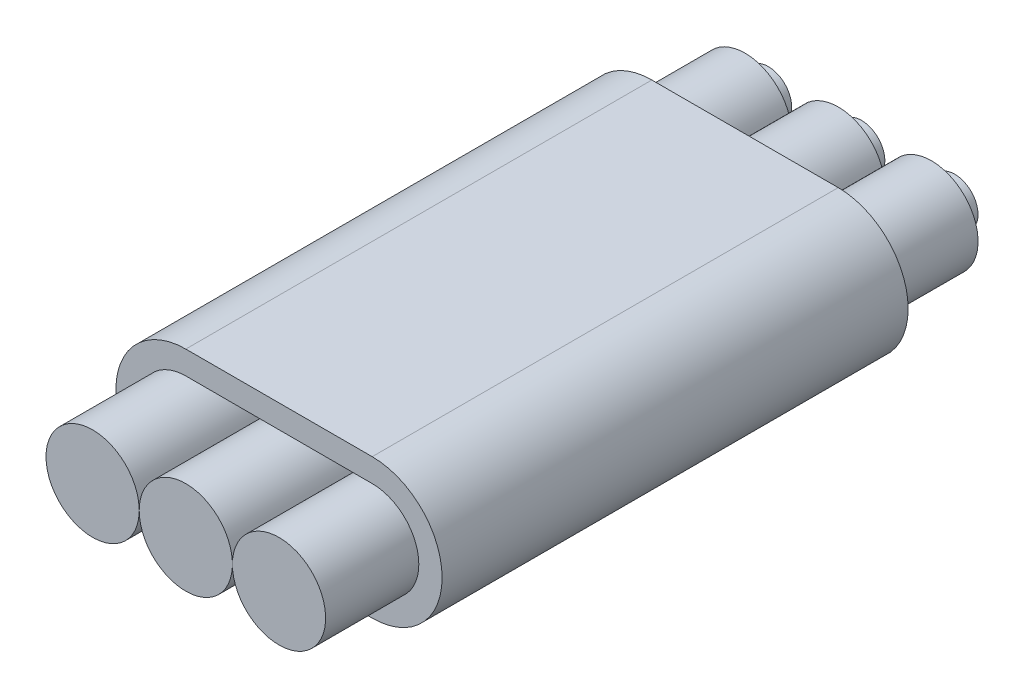
ISO-10303-21;
HEADER;
FILE_DESCRIPTION(('STEP AP214'),'2;1');
FILE_NAME('part.step','',(''),(''),'','','');
FILE_SCHEMA(('AUTOMOTIVE_DESIGN { 1 0 10303 214 1 1 1 1 }'));
ENDSEC;
DATA;
#1=APPLICATION_CONTEXT('core data for automotive mechanical design processes');
#2=APPLICATION_PROTOCOL_DEFINITION('international standard','automotive_design',2000,#1);
#3=PRODUCT_CONTEXT('',#1,'mechanical');
#4=PRODUCT('Part','Part','',(#3));
#5=PRODUCT_RELATED_PRODUCT_CATEGORY('part','',(#4));
#6=PRODUCT_DEFINITION_FORMATION('','',#4);
#7=PRODUCT_DEFINITION_CONTEXT('part definition',#1,'design');
#8=PRODUCT_DEFINITION('design','',#6,#7);
#9=PRODUCT_DEFINITION_SHAPE('','',#8);
#10=(LENGTH_UNIT() NAMED_UNIT(*) SI_UNIT(.MILLI.,.METRE.));
#11=(NAMED_UNIT(*) PLANE_ANGLE_UNIT() SI_UNIT($,.RADIAN.));
#12=(NAMED_UNIT(*) SI_UNIT($,.STERADIAN.) SOLID_ANGLE_UNIT());
#13=UNCERTAINTY_MEASURE_WITH_UNIT(LENGTH_MEASURE(1.E-05),#10,'distance_accuracy_value','');
#14=(GEOMETRIC_REPRESENTATION_CONTEXT(3) GLOBAL_UNCERTAINTY_ASSIGNED_CONTEXT((#13)) GLOBAL_UNIT_ASSIGNED_CONTEXT((#10,
#11,#12)) REPRESENTATION_CONTEXT('',''));
#15=CARTESIAN_POINT('',(0.,0.,0.));
#16=DIRECTION('',(0.,0.,1.));
#17=DIRECTION('',(1.,0.,0.));
#18=AXIS2_PLACEMENT_3D('',#15,#16,#17);
#19=CARTESIAN_POINT('',(0.,0.,12.));
#20=DIRECTION('',(0.,0.,-1.));
#21=DIRECTION('',(-1.,0.,0.));
#22=AXIS2_PLACEMENT_3D('',#19,#20,#21);
#23=CYLINDRICAL_SURFACE('',#22,1.);
#24=CARTESIAN_POINT('',(0.,0.,12.));
#25=DIRECTION('',(0.,0.,-1.));
#26=DIRECTION('',(-1.,0.,0.));
#27=AXIS2_PLACEMENT_3D('',#24,#25,#26);
#28=CIRCLE('',#27,1.);
#29=CARTESIAN_POINT('',(-1.,0.,12.));
#30=VERTEX_POINT('',#29);
#31=EDGE_CURVE('E132',#30,#30,#28,.T.);
#32=ORIENTED_EDGE('',*,*,#31,.T.);
#33=EDGE_LOOP('',(#32));
#34=FACE_BOUND('',#33,.T.);
#35=CARTESIAN_POINT('',(0.,0.,-2.));
#36=DIRECTION('',(0.,0.,-1.));
#37=DIRECTION('',(-1.,0.,0.));
#38=AXIS2_PLACEMENT_3D('',#35,#36,#37);
#39=CIRCLE('',#38,1.);
#40=CARTESIAN_POINT('',(-1.,0.,-2.));
#41=VERTEX_POINT('',#40);
#42=EDGE_CURVE('E128',#41,#41,#39,.T.);
#43=ORIENTED_EDGE('',*,*,#42,.F.);
#44=EDGE_LOOP('',(#43));
#45=FACE_BOUND('',#44,.T.);
#46=ADVANCED_FACE('F124',(#34,#45),#23,.T.);
#47=CARTESIAN_POINT('',(0.,0.,-2.));
#48=DIRECTION('',(0.,0.,-1.));
#49=DIRECTION('',(-1.,0.,0.));
#50=AXIS2_PLACEMENT_3D('',#47,#48,#49);
#51=PLANE('',#50);
#52=ORIENTED_EDGE('',*,*,#42,.T.);
#53=EDGE_LOOP('',(#52));
#54=FACE_BOUND('',#53,.T.);
#55=CARTESIAN_POINT('',(0.,0.,-2.));
#56=DIRECTION('',(0.,0.,-1.));
#57=DIRECTION('',(-1.,0.,0.));
#58=AXIS2_PLACEMENT_3D('',#55,#56,#57);
#59=CIRCLE('',#58,0.5);
#60=CARTESIAN_POINT('',(-0.5,0.,-2.));
#61=VERTEX_POINT('',#60);
#62=EDGE_CURVE('E12',#61,#61,#59,.T.);
#63=ORIENTED_EDGE('',*,*,#62,.F.);
#64=EDGE_LOOP('',(#63));
#65=FACE_BOUND('',#64,.T.);
#66=ADVANCED_FACE('F123',(#54,#65),#51,.T.);
#67=CARTESIAN_POINT('',(0.,0.,12.));
#68=DIRECTION('',(0.,0.,-1.));
#69=DIRECTION('',(-1.,0.,0.));
#70=AXIS2_PLACEMENT_3D('',#67,#68,#69);
#71=PLANE('',#70);
#72=ORIENTED_EDGE('',*,*,#31,.F.);
#73=EDGE_LOOP('',(#72));
#74=FACE_BOUND('',#73,.T.);
#75=ADVANCED_FACE('F149',(#74),#71,.F.);
#76=CARTESIAN_POINT('',(0.,0.,13.4142135623731));
#77=DIRECTION('',(0.,0.,-1.));
#78=DIRECTION('',(-1.,0.,0.));
#79=AXIS2_PLACEMENT_3D('',#76,#77,#78);
#80=CYLINDRICAL_SURFACE('',#79,0.5);
#81=ORIENTED_EDGE('',*,*,#62,.T.);
#82=EDGE_LOOP('',(#81));
#83=FACE_BOUND('',#82,.T.);
#84=CARTESIAN_POINT('',(0.,0.,-2.5));
#85=DIRECTION('',(0.,0.,-1.));
#86=DIRECTION('',(-1.,0.,0.));
#87=AXIS2_PLACEMENT_3D('',#84,#85,#86);
#88=CIRCLE('',#87,0.5);
#89=CARTESIAN_POINT('',(-0.5,0.,-2.5));
#90=VERTEX_POINT('',#89);
#91=EDGE_CURVE('E139',#90,#90,#88,.T.);
#92=ORIENTED_EDGE('',*,*,#91,.F.);
#93=EDGE_LOOP('',(#92));
#94=FACE_BOUND('',#93,.T.);
#95=ADVANCED_FACE('F147',(#83,#94),#80,.T.);
#96=CARTESIAN_POINT('',(0.,0.,-2.5));
#97=DIRECTION('',(0.,0.,-1.));
#98=DIRECTION('',(-1.,0.,0.));
#99=AXIS2_PLACEMENT_3D('',#96,#97,#98);
#100=PLANE('',#99);
#101=ORIENTED_EDGE('',*,*,#91,.T.);
#102=EDGE_LOOP('',(#101));
#103=FACE_BOUND('',#102,.T.);
#104=ADVANCED_FACE('F144',(#103),#100,.T.);
#105=CLOSED_SHELL('',(#46,#66,#75,#95,#104));
#106=MANIFOLD_SOLID_BREP('B2',#105);
#107=CARTESIAN_POINT('',(-2.,0.,10.));
#108=DIRECTION('',(0.,0.,1.));
#109=DIRECTION('',(1.,0.,0.));
#110=AXIS2_PLACEMENT_3D('',#107,#108,#109);
#111=PLANE('',#110);
#112=CARTESIAN_POINT('',(-2.,0.,10.));
#113=DIRECTION('',(0.,0.,1.));
#114=DIRECTION('',(1.,0.,0.));
#115=AXIS2_PLACEMENT_3D('',#112,#113,#114);
#116=CIRCLE('',#115,1.5);
#117=CARTESIAN_POINT('',(-2.,1.5,10.));
#118=VERTEX_POINT('',#117);
#119=CARTESIAN_POINT('',(-2.,-1.5,10.));
#120=VERTEX_POINT('',#119);
#121=EDGE_CURVE('E310',#118,#120,#116,.T.);
#122=ORIENTED_EDGE('',*,*,#121,.T.);
#123=DIRECTION('',(1.,0.,0.));
#124=VECTOR('',#123,1.);
#125=CARTESIAN_POINT('',(-2.,-1.5,10.));
#126=LINE('',#125,#124);
#127=CARTESIAN_POINT('',(2.,-1.5,10.));
#128=VERTEX_POINT('',#127);
#129=EDGE_CURVE('E309',#120,#128,#126,.T.);
#130=ORIENTED_EDGE('',*,*,#129,.T.);
#131=CARTESIAN_POINT('',(2.,0.,10.));
#132=DIRECTION('',(0.,0.,1.));
#133=DIRECTION('',(1.,0.,0.));
#134=AXIS2_PLACEMENT_3D('',#131,#132,#133);
#135=CIRCLE('',#134,1.5);
#136=CARTESIAN_POINT('',(2.,1.5,10.));
#137=VERTEX_POINT('',#136);
#138=EDGE_CURVE('E312',#128,#137,#135,.T.);
#139=ORIENTED_EDGE('',*,*,#138,.T.);
#140=DIRECTION('',(-1.,0.,0.));
#141=VECTOR('',#140,1.);
#142=CARTESIAN_POINT('',(-2.,1.5,10.));
#143=LINE('',#142,#141);
#144=EDGE_CURVE('E314',#137,#118,#143,.T.);
#145=ORIENTED_EDGE('',*,*,#144,.T.);
#146=EDGE_LOOP('',(#122,#130,#139,#145));
#147=FACE_BOUND('',#146,.T.);
#148=DIRECTION('',(1.,0.,0.));
#149=VECTOR('',#148,1.);
#150=CARTESIAN_POINT('',(-2.,-1.,10.));
#151=LINE('',#150,#149);
#152=CARTESIAN_POINT('',(-2.,-1.,10.));
#153=VERTEX_POINT('',#152);
#154=CARTESIAN_POINT('',(2.,-1.,10.));
#155=VERTEX_POINT('',#154);
#156=EDGE_CURVE('E379',#153,#155,#151,.T.);
#157=ORIENTED_EDGE('',*,*,#156,.F.);
#158=CARTESIAN_POINT('',(-2.,0.,10.));
#159=DIRECTION('',(0.,0.,1.));
#160=DIRECTION('',(1.,0.,0.));
#161=AXIS2_PLACEMENT_3D('',#158,#159,#160);
#162=CIRCLE('',#161,1.);
#163=CARTESIAN_POINT('',(-2.,1.,10.));
#164=VERTEX_POINT('',#163);
#165=EDGE_CURVE('E292',#164,#153,#162,.T.);
#166=ORIENTED_EDGE('',*,*,#165,.F.);
#167=DIRECTION('',(-1.,0.,0.));
#168=VECTOR('',#167,1.);
#169=CARTESIAN_POINT('',(-2.,1.,10.));
#170=LINE('',#169,#168);
#171=CARTESIAN_POINT('',(2.,1.,10.));
#172=VERTEX_POINT('',#171);
#173=EDGE_CURVE('E305',#172,#164,#170,.T.);
#174=ORIENTED_EDGE('',*,*,#173,.F.);
#175=CARTESIAN_POINT('',(2.,0.,10.));
#176=DIRECTION('',(0.,0.,1.));
#177=DIRECTION('',(1.,0.,0.));
#178=AXIS2_PLACEMENT_3D('',#175,#176,#177);
#179=CIRCLE('',#178,1.);
#180=EDGE_CURVE('E300',#155,#172,#179,.T.);
#181=ORIENTED_EDGE('',*,*,#180,.F.);
#182=EDGE_LOOP('',(#157,#166,#174,#181));
#183=FACE_BOUND('',#182,.T.);
#184=ADVANCED_FACE('F216',(#147,#183),#111,.T.);
#185=CARTESIAN_POINT('',(-2.,0.,0.));
#186=DIRECTION('',(0.,0.,1.));
#187=DIRECTION('',(1.,0.,0.));
#188=AXIS2_PLACEMENT_3D('',#185,#186,#187);
#189=PLANE('',#188);
#190=CARTESIAN_POINT('',(-2.,0.,0.));
#191=DIRECTION('',(0.,0.,1.));
#192=DIRECTION('',(1.,0.,0.));
#193=AXIS2_PLACEMENT_3D('',#190,#191,#192);
#194=CIRCLE('',#193,1.5);
#195=CARTESIAN_POINT('',(-2.,1.5,0.));
#196=VERTEX_POINT('',#195);
#197=CARTESIAN_POINT('',(-2.,-1.5,0.));
#198=VERTEX_POINT('',#197);
#199=EDGE_CURVE('E306',#196,#198,#194,.T.);
#200=ORIENTED_EDGE('',*,*,#199,.F.);
#201=DIRECTION('',(-1.,0.,0.));
#202=VECTOR('',#201,1.);
#203=CARTESIAN_POINT('',(-2.,1.5,0.));
#204=LINE('',#203,#202);
#205=CARTESIAN_POINT('',(2.,1.5,0.));
#206=VERTEX_POINT('',#205);
#207=EDGE_CURVE('E311',#206,#196,#204,.T.);
#208=ORIENTED_EDGE('',*,*,#207,.F.);
#209=CARTESIAN_POINT('',(2.,0.,0.));
#210=DIRECTION('',(0.,0.,1.));
#211=DIRECTION('',(1.,0.,0.));
#212=AXIS2_PLACEMENT_3D('',#209,#210,#211);
#213=CIRCLE('',#212,1.5);
#214=CARTESIAN_POINT('',(2.,-1.5,0.));
#215=VERTEX_POINT('',#214);
#216=EDGE_CURVE('E325',#215,#206,#213,.T.);
#217=ORIENTED_EDGE('',*,*,#216,.F.);
#218=DIRECTION('',(1.,0.,0.));
#219=VECTOR('',#218,1.);
#220=CARTESIAN_POINT('',(-2.,-1.5,0.));
#221=LINE('',#220,#219);
#222=EDGE_CURVE('E318',#198,#215,#221,.T.);
#223=ORIENTED_EDGE('',*,*,#222,.F.);
#224=EDGE_LOOP('',(#200,#208,#217,#223));
#225=FACE_BOUND('',#224,.T.);
#226=CARTESIAN_POINT('',(-2.,0.,0.));
#227=DIRECTION('',(0.,0.,1.));
#228=DIRECTION('',(1.,0.,0.));
#229=AXIS2_PLACEMENT_3D('',#226,#227,#228);
#230=CIRCLE('',#229,1.);
#231=CARTESIAN_POINT('',(-2.,1.,0.));
#232=VERTEX_POINT('',#231);
#233=CARTESIAN_POINT('',(-2.,-1.,0.));
#234=VERTEX_POINT('',#233);
#235=EDGE_CURVE('E390',#232,#234,#230,.T.);
#236=ORIENTED_EDGE('',*,*,#235,.T.);
#237=DIRECTION('',(1.,0.,0.));
#238=VECTOR('',#237,1.);
#239=CARTESIAN_POINT('',(-2.,-1.,0.));
#240=LINE('',#239,#238);
#241=CARTESIAN_POINT('',(2.,-1.,0.));
#242=VERTEX_POINT('',#241);
#243=EDGE_CURVE('E283',#234,#242,#240,.T.);
#244=ORIENTED_EDGE('',*,*,#243,.T.);
#245=CARTESIAN_POINT('',(2.,0.,0.));
#246=DIRECTION('',(0.,0.,1.));
#247=DIRECTION('',(1.,0.,0.));
#248=AXIS2_PLACEMENT_3D('',#245,#246,#247);
#249=CIRCLE('',#248,1.);
#250=CARTESIAN_POINT('',(2.,1.,0.));
#251=VERTEX_POINT('',#250);
#252=EDGE_CURVE('E278',#242,#251,#249,.T.);
#253=ORIENTED_EDGE('',*,*,#252,.T.);
#254=DIRECTION('',(-1.,0.,0.));
#255=VECTOR('',#254,1.);
#256=CARTESIAN_POINT('',(-2.,1.,0.));
#257=LINE('',#256,#255);
#258=EDGE_CURVE('E238',#251,#232,#257,.T.);
#259=ORIENTED_EDGE('',*,*,#258,.T.);
#260=EDGE_LOOP('',(#236,#244,#253,#259));
#261=FACE_BOUND('',#260,.T.);
#262=ADVANCED_FACE('F281',(#225,#261),#189,.F.);
#263=CARTESIAN_POINT('',(-2.,0.,10.));
#264=DIRECTION('',(0.,0.,-1.));
#265=DIRECTION('',(-1.,0.,0.));
#266=AXIS2_PLACEMENT_3D('',#263,#264,#265);
#267=CYLINDRICAL_SURFACE('',#266,1.5);
#268=ORIENTED_EDGE('',*,*,#199,.T.);
#269=DIRECTION('',(0.,0.,-1.));
#270=VECTOR('',#269,1.);
#271=CARTESIAN_POINT('',(-2.,-1.5,10.));
#272=LINE('',#271,#270);
#273=EDGE_CURVE('E122',#120,#198,#272,.T.);
#274=ORIENTED_EDGE('',*,*,#273,.F.);
#275=ORIENTED_EDGE('',*,*,#121,.F.);
#276=DIRECTION('',(0.,0.,-1.));
#277=VECTOR('',#276,1.);
#278=CARTESIAN_POINT('',(-2.,1.5,10.));
#279=LINE('',#278,#277);
#280=EDGE_CURVE('E320',#118,#196,#279,.T.);
#281=ORIENTED_EDGE('',*,*,#280,.T.);
#282=EDGE_LOOP('',(#268,#274,#275,#281));
#283=FACE_BOUND('',#282,.T.);
#284=ADVANCED_FACE('F218',(#283),#267,.T.);
#285=CARTESIAN_POINT('',(-2.,-1.5,10.));
#286=DIRECTION('',(0.,1.,0.));
#287=DIRECTION('',(-1.,0.,0.));
#288=AXIS2_PLACEMENT_3D('',#285,#286,#287);
#289=PLANE('',#288);
#290=ORIENTED_EDGE('',*,*,#222,.T.);
#291=DIRECTION('',(0.,0.,-1.));
#292=VECTOR('',#291,1.);
#293=CARTESIAN_POINT('',(2.,-1.5,10.));
#294=LINE('',#293,#292);
#295=EDGE_CURVE('E221',#128,#215,#294,.T.);
#296=ORIENTED_EDGE('',*,*,#295,.F.);
#297=ORIENTED_EDGE('',*,*,#129,.F.);
#298=ORIENTED_EDGE('',*,*,#273,.T.);
#299=EDGE_LOOP('',(#290,#296,#297,#298));
#300=FACE_BOUND('',#299,.T.);
#301=ADVANCED_FACE('F347',(#300),#289,.F.);
#302=CARTESIAN_POINT('',(2.,0.,10.));
#303=DIRECTION('',(0.,0.,-1.));
#304=DIRECTION('',(-1.,0.,0.));
#305=AXIS2_PLACEMENT_3D('',#302,#303,#304);
#306=CYLINDRICAL_SURFACE('',#305,1.5);
#307=ORIENTED_EDGE('',*,*,#216,.T.);
#308=DIRECTION('',(0.,0.,-1.));
#309=VECTOR('',#308,1.);
#310=CARTESIAN_POINT('',(2.,1.5,10.));
#311=LINE('',#310,#309);
#312=EDGE_CURVE('E330',#137,#206,#311,.T.);
#313=ORIENTED_EDGE('',*,*,#312,.F.);
#314=ORIENTED_EDGE('',*,*,#138,.F.);
#315=ORIENTED_EDGE('',*,*,#295,.T.);
#316=EDGE_LOOP('',(#307,#313,#314,#315));
#317=FACE_BOUND('',#316,.T.);
#318=ADVANCED_FACE('F331',(#317),#306,.T.);
#319=CARTESIAN_POINT('',(-2.,1.5,10.));
#320=DIRECTION('',(0.,-1.,0.));
#321=DIRECTION('',(1.,0.,0.));
#322=AXIS2_PLACEMENT_3D('',#319,#320,#321);
#323=PLANE('',#322);
#324=ORIENTED_EDGE('',*,*,#207,.T.);
#325=ORIENTED_EDGE('',*,*,#280,.F.);
#326=ORIENTED_EDGE('',*,*,#144,.F.);
#327=ORIENTED_EDGE('',*,*,#312,.T.);
#328=EDGE_LOOP('',(#324,#325,#326,#327));
#329=FACE_BOUND('',#328,.T.);
#330=ADVANCED_FACE('F345',(#329),#323,.F.);
#331=CARTESIAN_POINT('',(-2.,-1.,10.));
#332=DIRECTION('',(0.,1.,0.));
#333=DIRECTION('',(-1.,0.,0.));
#334=AXIS2_PLACEMENT_3D('',#331,#332,#333);
#335=PLANE('',#334);
#336=DIRECTION('',(0.,0.,-1.));
#337=VECTOR('',#336,1.);
#338=CARTESIAN_POINT('',(2.,-1.,10.));
#339=LINE('',#338,#337);
#340=EDGE_CURVE('E296',#155,#242,#339,.T.);
#341=ORIENTED_EDGE('',*,*,#340,.T.);
#342=ORIENTED_EDGE('',*,*,#243,.F.);
#343=DIRECTION('',(0.,0.,-1.));
#344=VECTOR('',#343,1.);
#345=CARTESIAN_POINT('',(-2.,-1.,10.));
#346=LINE('',#345,#344);
#347=EDGE_CURVE('E297',#153,#234,#346,.T.);
#348=ORIENTED_EDGE('',*,*,#347,.F.);
#349=ORIENTED_EDGE('',*,*,#156,.T.);
#350=EDGE_LOOP('',(#341,#342,#348,#349));
#351=FACE_BOUND('',#350,.T.);
#352=ADVANCED_FACE('F362',(#351),#335,.T.);
#353=CARTESIAN_POINT('',(-2.,1.,10.));
#354=DIRECTION('',(0.,-1.,0.));
#355=DIRECTION('',(1.,0.,0.));
#356=AXIS2_PLACEMENT_3D('',#353,#354,#355);
#357=PLANE('',#356);
#358=DIRECTION('',(0.,0.,-1.));
#359=VECTOR('',#358,1.);
#360=CARTESIAN_POINT('',(-2.,1.,10.));
#361=LINE('',#360,#359);
#362=EDGE_CURVE('E293',#164,#232,#361,.T.);
#363=ORIENTED_EDGE('',*,*,#362,.T.);
#364=ORIENTED_EDGE('',*,*,#258,.F.);
#365=DIRECTION('',(0.,0.,-1.));
#366=VECTOR('',#365,1.);
#367=CARTESIAN_POINT('',(2.,1.,10.));
#368=LINE('',#367,#366);
#369=EDGE_CURVE('E233',#172,#251,#368,.T.);
#370=ORIENTED_EDGE('',*,*,#369,.F.);
#371=ORIENTED_EDGE('',*,*,#173,.T.);
#372=EDGE_LOOP('',(#363,#364,#370,#371));
#373=FACE_BOUND('',#372,.T.);
#374=ADVANCED_FACE('F286',(#373),#357,.T.);
#375=CARTESIAN_POINT('',(-2.,0.,-2.));
#376=DIRECTION('',(0.,0.,1.));
#377=DIRECTION('',(1.,0.,0.));
#378=AXIS2_PLACEMENT_3D('',#375,#376,#377);
#379=CYLINDRICAL_SURFACE('',#378,1.);
#380=CARTESIAN_POINT('',(-2.,0.,-2.));
#381=DIRECTION('',(0.,0.,-1.));
#382=DIRECTION('',(-1.,0.,0.));
#383=AXIS2_PLACEMENT_3D('',#380,#381,#382);
#384=CIRCLE('',#383,1.);
#385=CARTESIAN_POINT('',(-3.,0.,-2.));
#386=VERTEX_POINT('',#385);
#387=EDGE_CURVE('E386',#386,#386,#384,.T.);
#388=ORIENTED_EDGE('',*,*,#387,.F.);
#389=EDGE_LOOP('',(#388));
#390=FACE_BOUND('',#389,.T.);
#391=CARTESIAN_POINT('',(-2.,0.,12.));
#392=DIRECTION('',(0.,0.,-1.));
#393=DIRECTION('',(-1.,0.,0.));
#394=AXIS2_PLACEMENT_3D('',#391,#392,#393);
#395=CIRCLE('',#394,1.);
#396=CARTESIAN_POINT('',(-3.,0.,12.));
#397=VERTEX_POINT('',#396);
#398=EDGE_CURVE('E397',#397,#397,#395,.T.);
#399=ORIENTED_EDGE('',*,*,#398,.T.);
#400=EDGE_LOOP('',(#399));
#401=FACE_BOUND('',#400,.T.);
#402=ORIENTED_EDGE('',*,*,#165,.T.);
#403=ORIENTED_EDGE('',*,*,#347,.T.);
#404=ORIENTED_EDGE('',*,*,#235,.F.);
#405=ORIENTED_EDGE('',*,*,#362,.F.);
#406=EDGE_LOOP('',(#402,#403,#404,#405));
#407=FACE_BOUND('',#406,.T.);
#408=ADVANCED_FACE('F380',(#390,#401,#407),#379,.T.);
#409=CARTESIAN_POINT('',(-2.,0.,-2.));
#410=DIRECTION('',(0.,0.,-1.));
#411=DIRECTION('',(-1.,0.,0.));
#412=AXIS2_PLACEMENT_3D('',#409,#410,#411);
#413=PLANE('',#412);
#414=ORIENTED_EDGE('',*,*,#387,.T.);
#415=EDGE_LOOP('',(#414));
#416=FACE_BOUND('',#415,.T.);
#417=CARTESIAN_POINT('',(-2.,0.,-2.));
#418=DIRECTION('',(0.,0.,-1.));
#419=DIRECTION('',(-1.,0.,0.));
#420=AXIS2_PLACEMENT_3D('',#417,#418,#419);
#421=CIRCLE('',#420,0.5);
#422=CARTESIAN_POINT('',(-2.5,0.,-2.));
#423=VERTEX_POINT('',#422);
#424=EDGE_CURVE('E391',#423,#423,#421,.T.);
#425=ORIENTED_EDGE('',*,*,#424,.F.);
#426=EDGE_LOOP('',(#425));
#427=FACE_BOUND('',#426,.T.);
#428=ADVANCED_FACE('F401',(#416,#427),#413,.T.);
#429=CARTESIAN_POINT('',(-2.,0.,12.));
#430=DIRECTION('',(0.,0.,-1.));
#431=DIRECTION('',(-1.,0.,0.));
#432=AXIS2_PLACEMENT_3D('',#429,#430,#431);
#433=PLANE('',#432);
#434=ORIENTED_EDGE('',*,*,#398,.F.);
#435=EDGE_LOOP('',(#434));
#436=FACE_BOUND('',#435,.T.);
#437=ADVANCED_FACE('F407',(#436),#433,.F.);
#438=CARTESIAN_POINT('',(2.,0.,12.));
#439=DIRECTION('',(0.,0.,-1.));
#440=DIRECTION('',(-1.,0.,0.));
#441=AXIS2_PLACEMENT_3D('',#438,#439,#440);
#442=CYLINDRICAL_SURFACE('',#441,1.);
#443=CARTESIAN_POINT('',(2.,0.,-2.));
#444=DIRECTION('',(0.,0.,-1.));
#445=DIRECTION('',(-1.,0.,0.));
#446=AXIS2_PLACEMENT_3D('',#443,#444,#445);
#447=CIRCLE('',#446,1.);
#448=CARTESIAN_POINT('',(1.,0.,-2.));
#449=VERTEX_POINT('',#448);
#450=EDGE_CURVE('E442',#449,#449,#447,.T.);
#451=ORIENTED_EDGE('',*,*,#450,.F.);
#452=EDGE_LOOP('',(#451));
#453=FACE_BOUND('',#452,.T.);
#454=CARTESIAN_POINT('',(2.,0.,12.));
#455=DIRECTION('',(0.,0.,-1.));
#456=DIRECTION('',(-1.,0.,0.));
#457=AXIS2_PLACEMENT_3D('',#454,#455,#456);
#458=CIRCLE('',#457,1.);
#459=CARTESIAN_POINT('',(1.,0.,12.));
#460=VERTEX_POINT('',#459);
#461=EDGE_CURVE('E450',#460,#460,#458,.T.);
#462=ORIENTED_EDGE('',*,*,#461,.T.);
#463=EDGE_LOOP('',(#462));
#464=FACE_BOUND('',#463,.T.);
#465=ORIENTED_EDGE('',*,*,#340,.F.);
#466=ORIENTED_EDGE('',*,*,#180,.T.);
#467=ORIENTED_EDGE('',*,*,#369,.T.);
#468=ORIENTED_EDGE('',*,*,#252,.F.);
#469=EDGE_LOOP('',(#465,#466,#467,#468));
#470=FACE_BOUND('',#469,.T.);
#471=ADVANCED_FACE('F294',(#453,#464,#470),#442,.T.);
#472=CARTESIAN_POINT('',(2.,0.,12.));
#473=DIRECTION('',(0.,0.,-1.));
#474=DIRECTION('',(-1.,0.,0.));
#475=AXIS2_PLACEMENT_3D('',#472,#473,#474);
#476=PLANE('',#475);
#477=ORIENTED_EDGE('',*,*,#461,.F.);
#478=EDGE_LOOP('',(#477));
#479=FACE_BOUND('',#478,.T.);
#480=ADVANCED_FACE('F419',(#479),#476,.F.);
#481=CARTESIAN_POINT('',(2.,0.,-2.));
#482=DIRECTION('',(0.,0.,-1.));
#483=DIRECTION('',(-1.,0.,0.));
#484=AXIS2_PLACEMENT_3D('',#481,#482,#483);
#485=PLANE('',#484);
#486=ORIENTED_EDGE('',*,*,#450,.T.);
#487=EDGE_LOOP('',(#486));
#488=FACE_BOUND('',#487,.T.);
#489=CARTESIAN_POINT('',(2.,0.,-2.));
#490=DIRECTION('',(0.,0.,-1.));
#491=DIRECTION('',(-1.,0.,0.));
#492=AXIS2_PLACEMENT_3D('',#489,#490,#491);
#493=CIRCLE('',#492,0.5);
#494=CARTESIAN_POINT('',(1.5,0.,-2.));
#495=VERTEX_POINT('',#494);
#496=EDGE_CURVE('E402',#495,#495,#493,.T.);
#497=ORIENTED_EDGE('',*,*,#496,.F.);
#498=EDGE_LOOP('',(#497));
#499=FACE_BOUND('',#498,.T.);
#500=ADVANCED_FACE('F424',(#488,#499),#485,.T.);
#501=CARTESIAN_POINT('',(2.,0.,-2.5));
#502=DIRECTION('',(0.,0.,-1.));
#503=DIRECTION('',(-1.,0.,0.));
#504=AXIS2_PLACEMENT_3D('',#501,#502,#503);
#505=PLANE('',#504);
#506=CARTESIAN_POINT('',(2.,0.,-2.5));
#507=DIRECTION('',(0.,0.,-1.));
#508=DIRECTION('',(-1.,0.,0.));
#509=AXIS2_PLACEMENT_3D('',#506,#507,#508);
#510=CIRCLE('',#509,0.5);
#511=CARTESIAN_POINT('',(1.5,0.,-2.5));
#512=VERTEX_POINT('',#511);
#513=EDGE_CURVE('E455',#512,#512,#510,.T.);
#514=ORIENTED_EDGE('',*,*,#513,.T.);
#515=EDGE_LOOP('',(#514));
#516=FACE_BOUND('',#515,.T.);
#517=ADVANCED_FACE('F434',(#516),#505,.T.);
#518=CARTESIAN_POINT('',(2.,0.,13.4142135623731));
#519=DIRECTION('',(0.,0.,-1.));
#520=DIRECTION('',(-1.,0.,0.));
#521=AXIS2_PLACEMENT_3D('',#518,#519,#520);
#522=CYLINDRICAL_SURFACE('',#521,0.5);
#523=ORIENTED_EDGE('',*,*,#496,.T.);
#524=EDGE_LOOP('',(#523));
#525=FACE_BOUND('',#524,.T.);
#526=ORIENTED_EDGE('',*,*,#513,.F.);
#527=EDGE_LOOP('',(#526));
#528=FACE_BOUND('',#527,.T.);
#529=ADVANCED_FACE('F431',(#525,#528),#522,.T.);
#530=CARTESIAN_POINT('',(-2.,0.,13.4142135623731));
#531=DIRECTION('',(0.,0.,-1.));
#532=DIRECTION('',(-1.,0.,0.));
#533=AXIS2_PLACEMENT_3D('',#530,#531,#532);
#534=CYLINDRICAL_SURFACE('',#533,0.5);
#535=ORIENTED_EDGE('',*,*,#424,.T.);
#536=EDGE_LOOP('',(#535));
#537=FACE_BOUND('',#536,.T.);
#538=CARTESIAN_POINT('',(-2.,0.,-2.5));
#539=DIRECTION('',(0.,0.,-1.));
#540=DIRECTION('',(-1.,0.,0.));
#541=AXIS2_PLACEMENT_3D('',#538,#539,#540);
#542=CIRCLE('',#541,0.5);
#543=CARTESIAN_POINT('',(-2.5,0.,-2.5));
#544=VERTEX_POINT('',#543);
#545=EDGE_CURVE('E453',#544,#544,#542,.T.);
#546=ORIENTED_EDGE('',*,*,#545,.F.);
#547=EDGE_LOOP('',(#546));
#548=FACE_BOUND('',#547,.T.);
#549=ADVANCED_FACE('F462',(#537,#548),#534,.T.);
#550=CARTESIAN_POINT('',(-2.,0.,-2.5));
#551=DIRECTION('',(0.,0.,-1.));
#552=DIRECTION('',(-1.,0.,0.));
#553=AXIS2_PLACEMENT_3D('',#550,#551,#552);
#554=PLANE('',#553);
#555=ORIENTED_EDGE('',*,*,#545,.T.);
#556=EDGE_LOOP('',(#555));
#557=FACE_BOUND('',#556,.T.);
#558=ADVANCED_FACE('F457',(#557),#554,.T.);
#559=CLOSED_SHELL('',(#184,#262,#284,#301,#318,#330,#352,#374,#408,#428,#437,#471,#480,#500,
#517,#529,#549,#558));
#560=MANIFOLD_SOLID_BREP('B7',#559);
#561=ADVANCED_BREP_SHAPE_REPRESENTATION('',(#18,#106,#560),#14);
#562=SHAPE_DEFINITION_REPRESENTATION(#9,#561);
ENDSEC;
END-ISO-10303-21;
